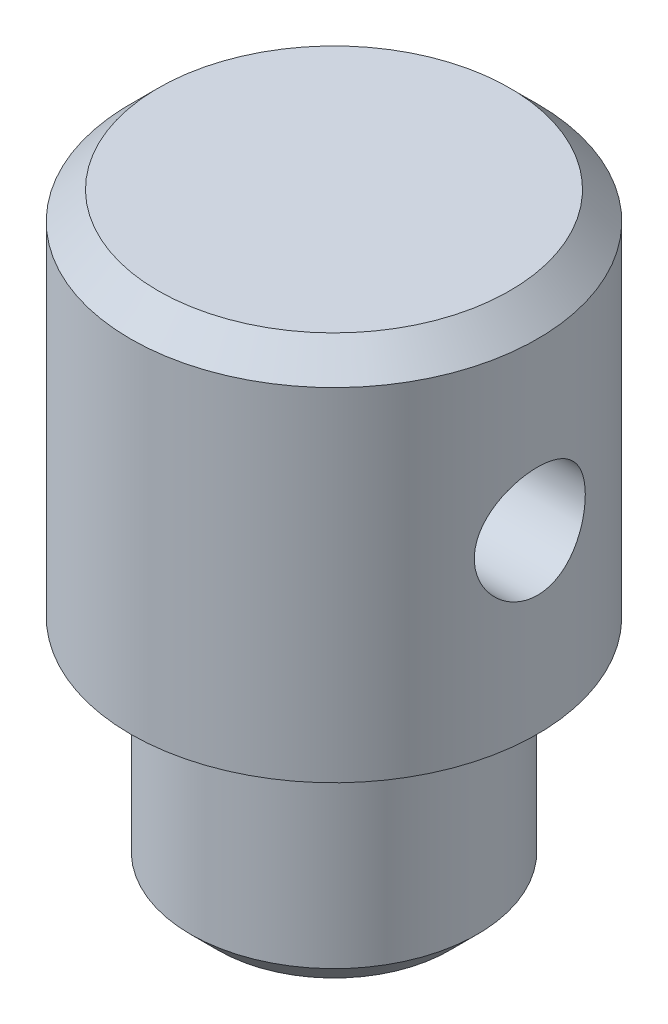
ISO-10303-21;
HEADER;
FILE_DESCRIPTION(('STEP AP214'),'2;1');
FILE_NAME('part.step','',(''),(''),'','','');
FILE_SCHEMA(('AUTOMOTIVE_DESIGN { 1 0 10303 214 1 1 1 1 }'));
ENDSEC;
DATA;
#1=APPLICATION_CONTEXT('core data for automotive mechanical design processes');
#2=APPLICATION_PROTOCOL_DEFINITION('international standard','automotive_design',2000,#1);
#3=PRODUCT_CONTEXT('',#1,'mechanical');
#4=PRODUCT('Part','Part','',(#3));
#5=PRODUCT_RELATED_PRODUCT_CATEGORY('part','',(#4));
#6=PRODUCT_DEFINITION_FORMATION('','',#4);
#7=PRODUCT_DEFINITION_CONTEXT('part definition',#1,'design');
#8=PRODUCT_DEFINITION('design','',#6,#7);
#9=PRODUCT_DEFINITION_SHAPE('','',#8);
#10=(LENGTH_UNIT() NAMED_UNIT(*) SI_UNIT(.MILLI.,.METRE.));
#11=(NAMED_UNIT(*) PLANE_ANGLE_UNIT() SI_UNIT($,.RADIAN.));
#12=(NAMED_UNIT(*) SI_UNIT($,.STERADIAN.) SOLID_ANGLE_UNIT());
#13=UNCERTAINTY_MEASURE_WITH_UNIT(LENGTH_MEASURE(1.E-05),#10,'distance_accuracy_value','');
#14=(GEOMETRIC_REPRESENTATION_CONTEXT(3) GLOBAL_UNCERTAINTY_ASSIGNED_CONTEXT((#13)) GLOBAL_UNIT_ASSIGNED_CONTEXT((#10,
#11,#12)) REPRESENTATION_CONTEXT('',''));
#15=CARTESIAN_POINT('',(0.,0.,0.));
#16=DIRECTION('',(0.,0.,1.));
#17=DIRECTION('',(1.,0.,0.));
#18=AXIS2_PLACEMENT_3D('',#15,#16,#17);
#19=CARTESIAN_POINT('',(0.,11.176,0.));
#20=DIRECTION('',(0.,-1.,0.));
#21=DIRECTION('',(0.,0.,-1.));
#22=AXIS2_PLACEMENT_3D('',#19,#20,#21);
#23=CONICAL_SURFACE('',#22,2.15265,1.02974425867665);
#24=CARTESIAN_POINT('',(0.,11.176,0.));
#25=DIRECTION('',(0.,-1.,0.));
#26=DIRECTION('',(0.,0.,-1.));
#27=AXIS2_PLACEMENT_3D('',#24,#25,#26);
#28=CIRCLE('',#27,2.15265);
#29=CARTESIAN_POINT('',(-1.52030458214746,11.176,-1.52400000000064));
#30=VERTEX_POINT('',#29);
#31=CARTESIAN_POINT('',(1.52030458214793,11.176,-1.524));
#32=VERTEX_POINT('',#31);
#33=EDGE_CURVE('E77',#30,#32,#28,.T.);
#34=ORIENTED_EDGE('',*,*,#33,.T.);
#35=CARTESIAN_POINT('',(3.29787976624261,10.3444721730035,-1.27715992457108));
#36=CARTESIAN_POINT('',(3.23806022010149,10.3738400518025,-1.29627241363358));
#37=CARTESIAN_POINT('',(3.17787610195081,10.4033152891528,-1.31402987169754));
#38=CARTESIAN_POINT('',(3.05689836514172,10.4623889537361,-1.34702798612494));
#39=CARTESIAN_POINT('',(2.99610489098697,10.4919873508327,-1.36226922488032));
#40=CARTESIAN_POINT('',(2.81306640232769,10.5807931001191,-1.404493317376));
#41=CARTESIAN_POINT('',(2.69004686835606,10.6400683088541,-1.42801285330245));
#42=CARTESIAN_POINT('',(2.44281623381528,10.7579894929945,-1.46686163914622));
#43=CARTESIAN_POINT('',(2.31860854064859,10.8166366053152,-1.48220967595342));
#44=CARTESIAN_POINT('',(2.06893056668057,10.9327239517723,-1.50562059032252));
#45=CARTESIAN_POINT('',(1.94346009456202,10.9901639988341,-1.51368234665116));
#46=CARTESIAN_POINT('',(1.71939428513136,11.0901895096117,-1.52221483208197));
#47=CARTESIAN_POINT('',(1.62104785234002,11.1332301697897,-1.52397780570327));
#48=CARTESIAN_POINT('',(1.42341870626431,11.2171325865091,-1.52402175473708));
#49=CARTESIAN_POINT('',(1.32413591557693,11.2579941610276,-1.52230243973389));
#50=CARTESIAN_POINT('',(1.12429075086631,11.3362712864495,-1.51605426325165));
#51=CARTESIAN_POINT('',(1.02372844285154,11.3736870143053,-1.51152554613465));
#52=CARTESIAN_POINT('',(0.871504848960846,11.4255342637082,-1.50353555310034));
#53=CARTESIAN_POINT('',(0.82054133815007,11.4421018027012,-1.50067325232053));
#54=CARTESIAN_POINT('',(0.718034227929452,11.4733907587156,-1.49478666840354));
#55=CARTESIAN_POINT('',(0.666490410105106,11.4881114534652,-1.49176232254885));
#56=CARTESIAN_POINT('',(0.547751983746071,11.5191009978442,-1.48498363500524));
#57=CARTESIAN_POINT('',(0.480344250293535,11.5345853359279,-1.48127127807787));
#58=CARTESIAN_POINT('',(0.344499620014715,11.5602479704979,-1.47482457306655));
#59=CARTESIAN_POINT('',(0.276063628764845,11.5704306831562,-1.47208941159186));
#60=CARTESIAN_POINT('',(0.138951678639813,11.5841510254726,-1.4683470430887));
#61=CARTESIAN_POINT('',(0.0702811409221827,11.587736739125,-1.46732733721198));
#62=CARTESIAN_POINT('',(-0.0670597458897905,11.5878480319342,-1.46729565815834));
#63=CARTESIAN_POINT('',(-0.135730094756946,11.5843740269779,-1.4682835667132));
#64=CARTESIAN_POINT('',(-0.296933261319599,11.5684723199361,-1.47262693772739));
#65=CARTESIAN_POINT('',(-0.389163153625569,11.5532730989821,-1.47670628079921));
#66=CARTESIAN_POINT('',(-0.571690722393062,11.5140653883206,-1.4861630713923));
#67=CARTESIAN_POINT('',(-0.661984655798466,11.4900412217777,-1.49154282313768));
#68=CARTESIAN_POINT('',(-0.841892514905804,11.4359637634229,-1.50192046523429));
#69=CARTESIAN_POINT('',(-0.931485704615879,11.4058424027192,-1.50691307534256));
#70=CARTESIAN_POINT('',(-1.10931125500022,11.3418724486231,-1.51529038452616));
#71=CARTESIAN_POINT('',(-1.19754457363715,11.3080266299092,-1.51867627073525));
#72=CARTESIAN_POINT('',(-1.37510111751281,11.2370856741603,-1.52320018727081));
#73=CARTESIAN_POINT('',(-1.46440296033261,11.19993383608,-1.52428490846007));
#74=CARTESIAN_POINT('',(-1.64168741788549,11.1241841032528,-1.52358756535989));
#75=CARTESIAN_POINT('',(-1.7296748374867,11.0855972131193,-1.52182414194373));
#76=CARTESIAN_POINT('',(-1.96634742101355,10.9799518356338,-1.51280943870004));
#77=CARTESIAN_POINT('',(-2.11446552577952,10.9118469470723,-1.50258356167067));
#78=CARTESIAN_POINT('',(-2.40893900557949,10.7741696351499,-1.4717684821923));
#79=CARTESIAN_POINT('',(-2.55529468345204,10.7045974697319,-1.45118108695517));
#80=CARTESIAN_POINT('',(-2.77454646484487,10.5992900465986,-1.41117909449147));
#81=CARTESIAN_POINT('',(-2.84830843231859,10.5636737432925,-1.39612996131798));
#82=CARTESIAN_POINT('',(-2.99509148068601,10.4924963125573,-1.36269746308424));
#83=CARTESIAN_POINT('',(-3.06811267795447,10.4569351772288,-1.34431463058863));
#84=CARTESIAN_POINT('',(-3.21337320215492,10.3859512482603,-1.30386969905939));
#85=CARTESIAN_POINT('',(-3.2856109704512,10.3505287972152,-1.28180133379812));
#86=CARTESIAN_POINT('',(-3.42893303521438,10.2800509692922,-1.23355477603399));
#87=CARTESIAN_POINT('',(-3.50001665944071,10.2449958102847,-1.20737427689586));
#88=CARTESIAN_POINT('',(-3.57036039394992,10.2102279610125,-1.17892339391072));
#89=B_SPLINE_CURVE_WITH_KNOTS('',3,(#35,#36,#37,#38,#39,#40,#41,#42,#43,#44,#45,#46,#47,#48,#49,
#50,#51,#52,#53,#54,#55,#56,#57,#58,#59,#60,#61,#62,#63,#64,#65,#66,#67,#68,#69,#70,#71,#72,#73,
#74,#75,#76,#77,#78,#79,#80,#81,#82,#83,#84,#85,#86,#87,#88),.UNSPECIFIED.,.F.,.F.,(4,2,2,2,2,2,
2,2,2,2,2,2,2,2,2,2,2,2,2,2,2,2,2,2,2,2,4),(0.,0.207942685373587,0.415837173656637,
0.831222767642638,1.24564918934191,1.66013937328716,1.98216208365632,2.30421165116206,
2.62624467141603,2.78721314026912,2.94824436641919,3.15587005210624,3.36332251098796,
3.56925681384104,3.77517898549164,4.05518268782131,4.33568621974539,4.61951357933277,
4.90313090426998,5.19324986953534,5.48147771234101,5.97119550954031,6.46082792183253,
6.71061514842876,6.96036250614824,7.21053889564728,7.46085612205296),.UNSPECIFIED.);
#90=EDGE_CURVE('E49',#32,#30,#89,.T.);
#91=ORIENTED_EDGE('',*,*,#90,.T.);
#92=EDGE_LOOP('',(#34,#91));
#93=FACE_BOUND('',#92,.T.);
#94=ADVANCED_FACE('F34',(#93),#23,.F.);
#95=CARTESIAN_POINT('',(3.937,0.,0.));
#96=DIRECTION('',(0.,1.,0.));
#97=DIRECTION('',(0.,0.,1.));
#98=AXIS2_PLACEMENT_3D('',#95,#96,#97);
#99=PLANE('',#98);
#100=CARTESIAN_POINT('',(0.,0.,0.));
#101=DIRECTION('',(0.,1.,0.));
#102=DIRECTION('',(0.,0.,1.));
#103=AXIS2_PLACEMENT_3D('',#100,#101,#102);
#104=CIRCLE('',#103,3.175);
#105=CARTESIAN_POINT('',(0.,0.,3.175));
#106=VERTEX_POINT('',#105);
#107=EDGE_CURVE('E11',#106,#106,#104,.F.);
#108=ORIENTED_EDGE('',*,*,#107,.T.);
#109=EDGE_LOOP('',(#108));
#110=FACE_BOUND('',#109,.T.);
#111=CARTESIAN_POINT('',(0.,0.,0.));
#112=DIRECTION('',(0.,-1.,0.));
#113=DIRECTION('',(0.,0.,-1.));
#114=AXIS2_PLACEMENT_3D('',#111,#112,#113);
#115=CIRCLE('',#114,2.15265);
#116=CARTESIAN_POINT('',(0.,0.,-2.15265));
#117=VERTEX_POINT('',#116);
#118=EDGE_CURVE('E82',#117,#117,#115,.T.);
#119=ORIENTED_EDGE('',*,*,#118,.F.);
#120=EDGE_LOOP('',(#119));
#121=FACE_BOUND('',#120,.T.);
#122=ADVANCED_FACE('F142',(#110,#121),#99,.F.);
#123=CARTESIAN_POINT('',(0.,16.51,0.));
#124=DIRECTION('',(0.,-1.,0.));
#125=DIRECTION('',(0.,0.,-1.));
#126=AXIS2_PLACEMENT_3D('',#123,#124,#125);
#127=PLANE('',#126);
#128=CARTESIAN_POINT('',(0.,16.51,0.));
#129=DIRECTION('',(0.,1.,0.));
#130=DIRECTION('',(0.,0.,1.));
#131=AXIS2_PLACEMENT_3D('',#128,#129,#130);
#132=CIRCLE('',#131,4.826);
#133=CARTESIAN_POINT('',(0.,16.51,4.826));
#134=VERTEX_POINT('',#133);
#135=EDGE_CURVE('E67',#134,#134,#132,.T.);
#136=ORIENTED_EDGE('',*,*,#135,.T.);
#137=EDGE_LOOP('',(#136));
#138=FACE_BOUND('',#137,.T.);
#139=ADVANCED_FACE('F139',(#138),#127,.F.);
#140=CARTESIAN_POINT('',(0.,15.748,0.));
#141=DIRECTION('',(0.,-1.,0.));
#142=DIRECTION('',(0.,0.,-1.));
#143=AXIS2_PLACEMENT_3D('',#140,#141,#142);
#144=CONICAL_SURFACE('',#143,5.588,0.78539816339745);
#145=ORIENTED_EDGE('',*,*,#135,.F.);
#146=EDGE_LOOP('',(#145));
#147=FACE_BOUND('',#146,.T.);
#148=CARTESIAN_POINT('',(0.,15.748,0.));
#149=DIRECTION('',(0.,1.,0.));
#150=DIRECTION('',(0.,0.,1.));
#151=AXIS2_PLACEMENT_3D('',#148,#149,#150);
#152=CIRCLE('',#151,5.588);
#153=CARTESIAN_POINT('',(0.,15.748,5.588));
#154=VERTEX_POINT('',#153);
#155=EDGE_CURVE('E88',#154,#154,#152,.T.);
#156=ORIENTED_EDGE('',*,*,#155,.T.);
#157=EDGE_LOOP('',(#156));
#158=FACE_BOUND('',#157,.T.);
#159=ADVANCED_FACE('F133',(#147,#158),#144,.T.);
#160=CARTESIAN_POINT('',(0.,0.,0.));
#161=DIRECTION('',(0.,1.,0.));
#162=DIRECTION('',(0.,0.,1.));
#163=AXIS2_PLACEMENT_3D('',#160,#161,#162);
#164=CYLINDRICAL_SURFACE('',#163,5.588);
#165=CARTESIAN_POINT('',(-5.37616666408325,11.176,-1.524));
#166=CARTESIAN_POINT('',(-5.37616804300174,11.2598773542442,-1.52399812748182));
#167=CARTESIAN_POINT('',(-5.37815107297096,11.3437742237148,-1.51705179532106));
#168=CARTESIAN_POINT('',(-5.38584385776009,11.5091398217048,-1.48950589161902));
#169=CARTESIAN_POINT('',(-5.39155537083186,11.5906073856665,-1.46889987847042));
#170=CARTESIAN_POINT('',(-5.40601120873454,11.7486980549692,-1.41476653416715));
#171=CARTESIAN_POINT('',(-5.41475113378016,11.8253279986787,-1.38125794052848));
#172=CARTESIAN_POINT('',(-5.43427335932362,11.9718918643845,-1.30232987207622));
#173=CARTESIAN_POINT('',(-5.44505584499428,12.0418251784171,-1.25690931721396));
#174=CARTESIAN_POINT('',(-5.46776438926798,12.1748399701,-1.15417585630728));
#175=CARTESIAN_POINT('',(-5.47971145954727,12.2377203336321,-1.0966071460596));
#176=CARTESIAN_POINT('',(-5.50322201657108,12.3530641002491,-0.971761355639928));
#177=CARTESIAN_POINT('',(-5.51478546187961,12.4055263810907,-0.904483230909276));
#178=CARTESIAN_POINT('',(-5.53646108440237,12.4993894048394,-0.760727553893654));
#179=CARTESIAN_POINT('',(-5.5465455894474,12.5405893173757,-0.68411433724799));
#180=CARTESIAN_POINT('',(-5.56388546919599,12.6094468340738,-0.524727131449397));
#181=CARTESIAN_POINT('',(-5.57114134372015,12.6371068309674,-0.441954233796653));
#182=CARTESIAN_POINT('',(-5.58185783372693,12.677445915853,-0.274697395077595));
#183=CARTESIAN_POINT('',(-5.58540503031416,12.6904673233222,-0.190301659954003));
#184=CARTESIAN_POINT('',(-5.58860759100706,12.7022375391347,-0.0204539814183477));
#185=CARTESIAN_POINT('',(-5.58826363527664,12.7009888418572,0.0649977747953786));
#186=CARTESIAN_POINT('',(-5.58378569705786,12.6844934029732,0.232145901673825));
#187=CARTESIAN_POINT('',(-5.57975189420777,12.6696166487076,0.313881881180458));
#188=CARTESIAN_POINT('',(-5.56846632402499,12.6268862703369,0.473650060975058));
#189=CARTESIAN_POINT('',(-5.56121436908868,12.5990318896904,0.551682045043329));
#190=CARTESIAN_POINT('',(-5.54416050301587,12.5308592299835,0.702760328685212));
#191=CARTESIAN_POINT('',(-5.53433319527761,12.4904160161333,0.775747267899446));
#192=CARTESIAN_POINT('',(-5.51318468463169,12.3983100834243,0.914023336959573));
#193=CARTESIAN_POINT('',(-5.50186317923083,12.3466450913987,0.979310903022773));
#194=CARTESIAN_POINT('',(-5.47852214729657,12.2316057169572,1.10254364073896));
#195=CARTESIAN_POINT('',(-5.46649187925547,12.1679089413082,1.16018618114064));
#196=CARTESIAN_POINT('',(-5.4434150595319,12.0316292614448,1.26404701502684));
#197=CARTESIAN_POINT('',(-5.43236857370046,11.9590457631546,1.31026454412704));
#198=CARTESIAN_POINT('',(-5.41246539163475,11.8063727356956,1.39020808985143));
#199=CARTESIAN_POINT('',(-5.40362387870643,11.7262361301334,1.42384824981065));
#200=CARTESIAN_POINT('',(-5.38931851221236,11.5611426361352,1.4770775620601));
#201=CARTESIAN_POINT('',(-5.38385377653585,11.4761870129011,1.4966703841311));
#202=CARTESIAN_POINT('',(-5.3771096438631,11.3067061835859,1.52071960483487));
#203=CARTESIAN_POINT('',(-5.37570505135209,11.2222501622477,1.52562894328488));
#204=CARTESIAN_POINT('',(-5.37689705621479,11.0537232381613,1.52142273932798));
#205=CARTESIAN_POINT('',(-5.37949320537176,10.9696522933299,1.51230876800049));
#206=CARTESIAN_POINT('',(-5.38827289403757,10.8060516036917,1.48071472169164));
#207=CARTESIAN_POINT('',(-5.39438240612689,10.7264642766401,1.45851023115131));
#208=CARTESIAN_POINT('',(-5.40942734659486,10.5721444539105,1.40167697147948));
#209=CARTESIAN_POINT('',(-5.4183631563766,10.4974126151123,1.36704652540581));
#210=CARTESIAN_POINT('',(-5.43830833062875,10.3530392805023,1.28543548631498));
#211=CARTESIAN_POINT('',(-5.44936041534607,10.2835531443029,1.2381907407348));
#212=CARTESIAN_POINT('',(-5.47219390937907,10.1533288775687,1.13301720688669));
#213=CARTESIAN_POINT('',(-5.48397546202295,10.0925924740583,1.07508631451621));
#214=CARTESIAN_POINT('',(-5.5073739486149,9.97969417422619,0.948083816809208));
#215=CARTESIAN_POINT('',(-5.5189749898684,9.92784907651086,0.878727069079916));
#216=CARTESIAN_POINT('',(-5.54033899968769,9.83653543474756,0.732033646426998));
#217=CARTESIAN_POINT('',(-5.55010206602792,9.79706623226694,0.654697396326539));
#218=CARTESIAN_POINT('',(-5.56662715196827,9.73199266068196,0.494784215562342));
#219=CARTESIAN_POINT('',(-5.57341167863512,9.7062839754547,0.412252173457353));
#220=CARTESIAN_POINT('',(-5.58331445001243,9.6691633362142,0.243825638558386));
#221=CARTESIAN_POINT('',(-5.58643354749725,9.65774805675184,0.1579319326738));
#222=CARTESIAN_POINT('',(-5.58861170674628,9.64975451798798,-0.0118259551969336));
#223=CARTESIAN_POINT('',(-5.58779766354495,9.65271254995239,-0.095666975854073));
#224=CARTESIAN_POINT('',(-5.58249008252059,9.67229945374695,-0.261611165511358));
#225=CARTESIAN_POINT('',(-5.57799669433588,9.68892776960916,-0.343714405047454));
#226=CARTESIAN_POINT('',(-5.5658625072452,9.7351162882649,-0.503267506235996));
#227=CARTESIAN_POINT('',(-5.5582455611002,9.76457858941208,-0.580747643983709));
#228=CARTESIAN_POINT('',(-5.54065887974846,9.83551156747967,-0.729708847536494));
#229=CARTESIAN_POINT('',(-5.53068880321045,9.87698398671552,-0.801189040983807));
#230=CARTESIAN_POINT('',(-5.50911559945224,9.97209560393421,-0.938264493998557));
#231=CARTESIAN_POINT('',(-5.4974749461141,10.0260394575956,-1.00364243590428));
#232=CARTESIAN_POINT('',(-5.47401845248945,10.143990012767,-1.12457480132179));
#233=CARTESIAN_POINT('',(-5.46220256622777,10.2079993989985,-1.18012659553798));
#234=CARTESIAN_POINT('',(-5.43941515917497,10.3460575672602,-1.2811146951888));
#235=CARTESIAN_POINT('',(-5.42846972381451,10.4203055019237,-1.32628517864541));
#236=CARTESIAN_POINT('',(-5.40903826233291,10.575631320272,-1.40343947203878));
#237=CARTESIAN_POINT('',(-5.40055069933018,10.6567048948385,-1.43543152761789));
#238=CARTESIAN_POINT('',(-5.38811705277488,10.8105123075606,-1.48135452930553));
#239=CARTESIAN_POINT('',(-5.38367291879896,10.8826081242516,-1.49730796522498));
#240=CARTESIAN_POINT('',(-5.37769730231429,11.0284644026692,-1.5186308544203));
#241=CARTESIAN_POINT('',(-5.37616545123871,11.1022246525561,-1.52400164699614));
#242=CARTESIAN_POINT('',(-5.37616666408325,11.176,-1.524));
#243=B_SPLINE_CURVE_WITH_KNOTS('',3,(#165,#166,#167,#168,#169,#170,#171,#172,#173,#174,#175,
#176,#177,#178,#179,#180,#181,#182,#183,#184,#185,#186,#187,#188,#189,#190,#191,#192,#193,#194,
#195,#196,#197,#198,#199,#200,#201,#202,#203,#204,#205,#206,#207,#208,#209,#210,#211,#212,#213,
#214,#215,#216,#217,#218,#219,#220,#221,#222,#223,#224,#225,#226,#227,#228,#229,#230,#231,#232,
#233,#234,#235,#236,#237,#238,#239,#240,#241,#242),.UNSPECIFIED.,.T.,.F.,(4,2,2,2,2,2,2,2,2,2,2,
2,2,2,2,2,2,2,2,2,2,2,2,2,2,2,2,2,2,2,2,2,2,2,2,2,2,2,4),(0.,0.251360636614238,0.50283989382213,
0.753955314328074,1.00509351115907,1.26216996232839,1.51927409095353,1.78070136944699,
2.04208243263313,2.29721504509398,2.55230306168678,2.80066457783834,3.04904057423919,
3.29996464428527,3.55093959085982,3.80996359536082,4.0690049250377,4.32978358659915,
4.59049409648812,4.84307501325495,5.09562763457735,5.34304430446494,5.59049437698226,
5.84359944297056,6.09675439865193,6.35760533583373,6.61844239265153,6.87727302996514,
7.13604343753665,7.38652194057101,7.63699025719444,7.88558049560441,8.13420681523925,
8.38970641481071,8.64527427827086,8.90679632125801,9.16815448242474,9.38926977393829,
9.61035708012516),.UNSPECIFIED.);
#244=CARTESIAN_POINT('',(-5.37616666408325,11.176,-1.524));
#245=VERTEX_POINT('',#244);
#246=EDGE_CURVE('E124',#245,#245,#243,.T.);
#247=ORIENTED_EDGE('',*,*,#246,.T.);
#248=EDGE_LOOP('',(#247));
#249=FACE_BOUND('',#248,.T.);
#250=CARTESIAN_POINT('',(5.37616666408325,11.176,-1.524));
#251=CARTESIAN_POINT('',(5.37616804300174,11.0921226457558,-1.52399812748182));
#252=CARTESIAN_POINT('',(5.37815107297096,11.0082257762852,-1.51705179532106));
#253=CARTESIAN_POINT('',(5.38584385776009,10.8428601782952,-1.48950589161902));
#254=CARTESIAN_POINT('',(5.39155537083186,10.7613926143335,-1.46889987847042));
#255=CARTESIAN_POINT('',(5.40601120873454,10.6033019450308,-1.41476653416715));
#256=CARTESIAN_POINT('',(5.41475113378016,10.5266720013213,-1.38125794052848));
#257=CARTESIAN_POINT('',(5.43427335932362,10.3801081356155,-1.30232987207622));
#258=CARTESIAN_POINT('',(5.44505584499428,10.3101748215829,-1.25690931721396));
#259=CARTESIAN_POINT('',(5.46776438926798,10.1771600299,-1.15417585630728));
#260=CARTESIAN_POINT('',(5.47971145954727,10.1142796663679,-1.0966071460596));
#261=CARTESIAN_POINT('',(5.50322201657108,9.9989358997509,-0.971761355639928));
#262=CARTESIAN_POINT('',(5.51478546187961,9.94647361890933,-0.904483230909276));
#263=CARTESIAN_POINT('',(5.53646108440237,9.85261059516055,-0.760727553893654));
#264=CARTESIAN_POINT('',(5.5465455894474,9.81141068262433,-0.68411433724799));
#265=CARTESIAN_POINT('',(5.56388546919599,9.74255316592621,-0.524727131449397));
#266=CARTESIAN_POINT('',(5.57114134372015,9.71489316903259,-0.441954233796653));
#267=CARTESIAN_POINT('',(5.58185783372693,9.67455408414697,-0.274697395077595));
#268=CARTESIAN_POINT('',(5.58540503031416,9.66153267667783,-0.190301659954003));
#269=CARTESIAN_POINT('',(5.58860759100706,9.64976246086528,-0.0204539814183477));
#270=CARTESIAN_POINT('',(5.58826363527664,9.65101115814281,0.0649977747953786));
#271=CARTESIAN_POINT('',(5.58378569705786,9.66750659702677,0.232145901673825));
#272=CARTESIAN_POINT('',(5.57975189420777,9.68238335129237,0.313881881180458));
#273=CARTESIAN_POINT('',(5.56846632402499,9.72511372966311,0.473650060975058));
#274=CARTESIAN_POINT('',(5.56121436908868,9.75296811030959,0.551682045043329));
#275=CARTESIAN_POINT('',(5.54416050301587,9.82114077001651,0.702760328685212));
#276=CARTESIAN_POINT('',(5.53433319527761,9.8615839838667,0.775747267899446));
#277=CARTESIAN_POINT('',(5.51318468463169,9.95368991657568,0.914023336959573));
#278=CARTESIAN_POINT('',(5.50186317923083,10.0053549086013,0.979310903022773));
#279=CARTESIAN_POINT('',(5.47852214729657,10.1203942830428,1.10254364073896));
#280=CARTESIAN_POINT('',(5.46649187925547,10.1840910586918,1.16018618114064));
#281=CARTESIAN_POINT('',(5.4434150595319,10.3203707385552,1.26404701502684));
#282=CARTESIAN_POINT('',(5.43236857370046,10.3929542368454,1.31026454412704));
#283=CARTESIAN_POINT('',(5.41246539163475,10.5456272643044,1.39020808985143));
#284=CARTESIAN_POINT('',(5.40362387870643,10.6257638698666,1.42384824981065));
#285=CARTESIAN_POINT('',(5.38931851221236,10.7908573638648,1.47707756206009));
#286=CARTESIAN_POINT('',(5.38385377653585,10.8758129870989,1.4966703841311));
#287=CARTESIAN_POINT('',(5.3771096438631,11.0452938164141,1.52071960483487));
#288=CARTESIAN_POINT('',(5.37570505135209,11.1297498377523,1.52562894328488));
#289=CARTESIAN_POINT('',(5.37689705621479,11.2982767618387,1.52142273932798));
#290=CARTESIAN_POINT('',(5.37949320537176,11.3823477066701,1.51230876800049));
#291=CARTESIAN_POINT('',(5.38827289403757,11.5459483963083,1.48071472169164));
#292=CARTESIAN_POINT('',(5.39438240612689,11.6255357233599,1.45851023115131));
#293=CARTESIAN_POINT('',(5.40942734659486,11.7798555460895,1.40167697147948));
#294=CARTESIAN_POINT('',(5.4183631563766,11.8545873848877,1.36704652540581));
#295=CARTESIAN_POINT('',(5.43830833062875,11.9989607194977,1.28543548631498));
#296=CARTESIAN_POINT('',(5.44936041534607,12.0684468556971,1.2381907407348));
#297=CARTESIAN_POINT('',(5.47219390937907,12.1986711224313,1.13301720688669));
#298=CARTESIAN_POINT('',(5.48397546202295,12.2594075259417,1.07508631451621));
#299=CARTESIAN_POINT('',(5.5073739486149,12.3723058257738,0.948083816809208));
#300=CARTESIAN_POINT('',(5.5189749898684,12.4241509234891,0.878727069079915));
#301=CARTESIAN_POINT('',(5.54033899968769,12.5154645652524,0.732033646426997));
#302=CARTESIAN_POINT('',(5.55010206602792,12.5549337677331,0.654697396326539));
#303=CARTESIAN_POINT('',(5.56662715196827,12.620007339318,0.494784215562342));
#304=CARTESIAN_POINT('',(5.57341167863512,12.6457160245453,0.412252173457353));
#305=CARTESIAN_POINT('',(5.58331445001243,12.6828366637858,0.243825638558385));
#306=CARTESIAN_POINT('',(5.58643354749725,12.6942519432482,0.1579319326738));
#307=CARTESIAN_POINT('',(5.58861170674628,12.702245482012,-0.0118259551969336));
#308=CARTESIAN_POINT('',(5.58779766354495,12.6992874500476,-0.0956669758540732));
#309=CARTESIAN_POINT('',(5.58249008252059,12.6797005462531,-0.261611165511358));
#310=CARTESIAN_POINT('',(5.57799669433588,12.6630722303908,-0.343714405047454));
#311=CARTESIAN_POINT('',(5.5658625072452,12.6168837117351,-0.503267506235996));
#312=CARTESIAN_POINT('',(5.5582455611002,12.5874214105879,-0.580747643983709));
#313=CARTESIAN_POINT('',(5.54065887974846,12.5164884325203,-0.729708847536494));
#314=CARTESIAN_POINT('',(5.53068880321045,12.4750160132845,-0.801189040983807));
#315=CARTESIAN_POINT('',(5.50911559945224,12.3799043960658,-0.938264493998558));
#316=CARTESIAN_POINT('',(5.4974749461141,12.3259605424044,-1.00364243590428));
#317=CARTESIAN_POINT('',(5.47401845248945,12.208009987233,-1.12457480132179));
#318=CARTESIAN_POINT('',(5.46220256622777,12.1440006010015,-1.18012659553798));
#319=CARTESIAN_POINT('',(5.43941515917497,12.0059424327398,-1.2811146951888));
#320=CARTESIAN_POINT('',(5.42846972381451,11.9316944980763,-1.32628517864541));
#321=CARTESIAN_POINT('',(5.40903826233291,11.776368679728,-1.40343947203878));
#322=CARTESIAN_POINT('',(5.40055069933018,11.6952951051615,-1.43543152761789));
#323=CARTESIAN_POINT('',(5.38811705277488,11.5414876924394,-1.48135452930553));
#324=CARTESIAN_POINT('',(5.38367291879896,11.4693918757484,-1.49730796522498));
#325=CARTESIAN_POINT('',(5.37769730231429,11.3235355973308,-1.5186308544203));
#326=CARTESIAN_POINT('',(5.37616545123871,11.2497753474439,-1.52400164699614));
#327=CARTESIAN_POINT('',(5.37616666408325,11.176,-1.524));
#328=B_SPLINE_CURVE_WITH_KNOTS('',3,(#250,#251,#252,#253,#254,#255,#256,#257,#258,#259,#260,
#261,#262,#263,#264,#265,#266,#267,#268,#269,#270,#271,#272,#273,#274,#275,#276,#277,#278,#279,
#280,#281,#282,#283,#284,#285,#286,#287,#288,#289,#290,#291,#292,#293,#294,#295,#296,#297,#298,
#299,#300,#301,#302,#303,#304,#305,#306,#307,#308,#309,#310,#311,#312,#313,#314,#315,#316,#317,
#318,#319,#320,#321,#322,#323,#324,#325,#326,#327),.UNSPECIFIED.,.T.,.F.,(4,2,2,2,2,2,2,2,2,2,2,
2,2,2,2,2,2,2,2,2,2,2,2,2,2,2,2,2,2,2,2,2,2,2,2,2,2,2,4),(0.,0.251360636614238,0.50283989382213,
0.753955314328074,1.00509351115907,1.26216996232839,1.51927409095353,1.78070136944699,
2.04208243263313,2.29721504509398,2.55230306168678,2.80066457783834,3.04904057423919,
3.29996464428527,3.55093959085982,3.80996359536082,4.0690049250377,4.32978358659915,
4.59049409648812,4.84307501325495,5.09562763457735,5.34304430446494,5.59049437698226,
5.84359944297056,6.09675439865193,6.35760533583373,6.61844239265153,6.87727302996514,
7.13604343753665,7.38652194057101,7.63699025719444,7.88558049560441,8.13420681523925,
8.38970641481071,8.64527427827086,8.90679632125801,9.16815448242474,9.38926977393829,
9.61035708012516),.UNSPECIFIED.);
#329=CARTESIAN_POINT('',(5.37616666408325,11.176,-1.524));
#330=VERTEX_POINT('',#329);
#331=EDGE_CURVE('E119',#330,#330,#328,.T.);
#332=ORIENTED_EDGE('',*,*,#331,.T.);
#333=EDGE_LOOP('',(#332));
#334=FACE_BOUND('',#333,.T.);
#335=ORIENTED_EDGE('',*,*,#155,.F.);
#336=EDGE_LOOP('',(#335));
#337=FACE_BOUND('',#336,.T.);
#338=CARTESIAN_POINT('',(0.,6.35,0.));
#339=DIRECTION('',(0.,1.,0.));
#340=DIRECTION('',(0.,0.,1.));
#341=AXIS2_PLACEMENT_3D('',#338,#339,#340);
#342=CIRCLE('',#341,5.588);
#343=CARTESIAN_POINT('',(0.,6.35,5.588));
#344=VERTEX_POINT('',#343);
#345=EDGE_CURVE('E80',#344,#344,#342,.T.);
#346=ORIENTED_EDGE('',*,*,#345,.T.);
#347=EDGE_LOOP('',(#346));
#348=FACE_BOUND('',#347,.T.);
#349=ADVANCED_FACE('F127',(#249,#334,#337,#348),#164,.T.);
#350=CARTESIAN_POINT('',(5.588,6.35,0.));
#351=DIRECTION('',(0.,1.,0.));
#352=DIRECTION('',(0.,0.,1.));
#353=AXIS2_PLACEMENT_3D('',#350,#351,#352);
#354=PLANE('',#353);
#355=ORIENTED_EDGE('',*,*,#345,.F.);
#356=EDGE_LOOP('',(#355));
#357=FACE_BOUND('',#356,.T.);
#358=CARTESIAN_POINT('',(0.,6.35,0.));
#359=DIRECTION('',(0.,1.,0.));
#360=DIRECTION('',(0.,0.,1.));
#361=AXIS2_PLACEMENT_3D('',#358,#359,#360);
#362=CIRCLE('',#361,3.937);
#363=CARTESIAN_POINT('',(0.,6.35,3.937));
#364=VERTEX_POINT('',#363);
#365=EDGE_CURVE('E76',#364,#364,#362,.T.);
#366=ORIENTED_EDGE('',*,*,#365,.T.);
#367=EDGE_LOOP('',(#366));
#368=FACE_BOUND('',#367,.T.);
#369=ADVANCED_FACE('F132',(#357,#368),#354,.F.);
#370=CARTESIAN_POINT('',(0.,0.,0.));
#371=DIRECTION('',(0.,1.,0.));
#372=DIRECTION('',(0.,0.,1.));
#373=AXIS2_PLACEMENT_3D('',#370,#371,#372);
#374=CYLINDRICAL_SURFACE('',#373,3.937);
#375=CARTESIAN_POINT('',(0.,0.762,0.));
#376=DIRECTION('',(0.,1.,0.));
#377=DIRECTION('',(0.,0.,1.));
#378=AXIS2_PLACEMENT_3D('',#375,#376,#377);
#379=CIRCLE('',#378,3.937);
#380=CARTESIAN_POINT('',(0.,0.762,3.937));
#381=VERTEX_POINT('',#380);
#382=EDGE_CURVE('E42',#381,#381,#379,.T.);
#383=ORIENTED_EDGE('',*,*,#382,.T.);
#384=EDGE_LOOP('',(#383));
#385=FACE_BOUND('',#384,.T.);
#386=ORIENTED_EDGE('',*,*,#365,.F.);
#387=EDGE_LOOP('',(#386));
#388=FACE_BOUND('',#387,.T.);
#389=ADVANCED_FACE('F165',(#385,#388),#374,.T.);
#390=CARTESIAN_POINT('',(1.52030458214793,11.176,1.524));
#391=VERTEX_POINT('',#390);
#392=CARTESIAN_POINT('',(-1.52030458214883,11.1759999999997,1.52400000000048));
#393=VERTEX_POINT('',#392);
#394=EDGE_CURVE('E72',#391,#393,#28,.T.);
#395=ORIENTED_EDGE('',*,*,#394,.T.);
#396=CARTESIAN_POINT('',(-3.29787976624261,10.3444721730035,1.27715992457108));
#397=CARTESIAN_POINT('',(-3.23806022010149,10.3738400518025,1.29627241363358));
#398=CARTESIAN_POINT('',(-3.17787610195081,10.4033152891528,1.31402987169754));
#399=CARTESIAN_POINT('',(-3.05689836514172,10.4623889537361,1.34702798612494));
#400=CARTESIAN_POINT('',(-2.99610489098697,10.4919873508327,1.36226922488032));
#401=CARTESIAN_POINT('',(-2.81306640232769,10.5807931001191,1.404493317376));
#402=CARTESIAN_POINT('',(-2.69004686835606,10.6400683088541,1.42801285330245));
#403=CARTESIAN_POINT('',(-2.44281623381528,10.7579894929945,1.46686163914622));
#404=CARTESIAN_POINT('',(-2.31860854064859,10.8166366053152,1.48220967595342));
#405=CARTESIAN_POINT('',(-2.06893056668057,10.9327239517723,1.50562059032252));
#406=CARTESIAN_POINT('',(-1.94346009456202,10.9901639988341,1.51368234665116));
#407=CARTESIAN_POINT('',(-1.71939428513136,11.0901895096117,1.52221483208197));
#408=CARTESIAN_POINT('',(-1.62104785234002,11.1332301697897,1.52397780570327));
#409=CARTESIAN_POINT('',(-1.42341870626431,11.2171325865091,1.52402175473708));
#410=CARTESIAN_POINT('',(-1.32413591557693,11.2579941610276,1.52230243973389));
#411=CARTESIAN_POINT('',(-1.12429075086631,11.3362712864495,1.51605426325165));
#412=CARTESIAN_POINT('',(-1.02372844285154,11.3736870143053,1.51152554613465));
#413=CARTESIAN_POINT('',(-0.871504848960847,11.4255342637082,1.50353555310034));
#414=CARTESIAN_POINT('',(-0.820541338150071,11.4421018027012,1.50067325232053));
#415=CARTESIAN_POINT('',(-0.718034227929453,11.4733907587156,1.49478666840354));
#416=CARTESIAN_POINT('',(-0.666490410105107,11.4881114534652,1.49176232254885));
#417=CARTESIAN_POINT('',(-0.547751983746072,11.5191009978442,1.48498363500524));
#418=CARTESIAN_POINT('',(-0.480344250293535,11.5345853359279,1.48127127807787));
#419=CARTESIAN_POINT('',(-0.344499620014716,11.5602479704979,1.47482457306655));
#420=CARTESIAN_POINT('',(-0.276063628764846,11.5704306831562,1.47208941159186));
#421=CARTESIAN_POINT('',(-0.138951678639814,11.5841510254726,1.4683470430887));
#422=CARTESIAN_POINT('',(-0.0702811409221833,11.587736739125,1.46732733721198));
#423=CARTESIAN_POINT('',(0.0670597458897898,11.5878480319342,1.46729565815834));
#424=CARTESIAN_POINT('',(0.135730094756946,11.5843740269779,1.4682835667132));
#425=CARTESIAN_POINT('',(0.296933261319599,11.5684723199361,1.47262693772739));
#426=CARTESIAN_POINT('',(0.389163153625569,11.5532730989821,1.47670628079921));
#427=CARTESIAN_POINT('',(0.571690722393062,11.5140653883206,1.4861630713923));
#428=CARTESIAN_POINT('',(0.661984655798466,11.4900412217777,1.49154282313768));
#429=CARTESIAN_POINT('',(0.841892514905803,11.4359637634229,1.50192046523429));
#430=CARTESIAN_POINT('',(0.931485704615878,11.4058424027192,1.50691307534256));
#431=CARTESIAN_POINT('',(1.10931125500022,11.3418724486231,1.51529038452616));
#432=CARTESIAN_POINT('',(1.19754457363715,11.3080266299092,1.51867627073525));
#433=CARTESIAN_POINT('',(1.3751011175128,11.2370856741603,1.52320018727081));
#434=CARTESIAN_POINT('',(1.46440296033261,11.19993383608,1.52428490846007));
#435=CARTESIAN_POINT('',(1.64168741788549,11.1241841032528,1.52358756535989));
#436=CARTESIAN_POINT('',(1.7296748374867,11.0855972131193,1.52182414194373));
#437=CARTESIAN_POINT('',(1.96634742101355,10.9799518356338,1.51280943870004));
#438=CARTESIAN_POINT('',(2.11446552577952,10.9118469470723,1.50258356167067));
#439=CARTESIAN_POINT('',(2.40893900557949,10.7741696351499,1.4717684821923));
#440=CARTESIAN_POINT('',(2.55529468345204,10.7045974697319,1.45118108695517));
#441=CARTESIAN_POINT('',(2.77454646484486,10.5992900465986,1.41117909449147));
#442=CARTESIAN_POINT('',(2.84830843231859,10.5636737432925,1.39612996131798));
#443=CARTESIAN_POINT('',(2.99509148068601,10.4924963125573,1.36269746308424));
#444=CARTESIAN_POINT('',(3.06811267795447,10.4569351772288,1.34431463058863));
#445=CARTESIAN_POINT('',(3.21337320215492,10.3859512482603,1.30386969905939));
#446=CARTESIAN_POINT('',(3.2856109704512,10.3505287972152,1.28180133379812));
#447=CARTESIAN_POINT('',(3.42893303521438,10.2800509692922,1.23355477603399));
#448=CARTESIAN_POINT('',(3.50001665944071,10.2449958102847,1.20737427689586));
#449=CARTESIAN_POINT('',(3.57036039394992,10.2102279610125,1.17892339391073));
#450=B_SPLINE_CURVE_WITH_KNOTS('',3,(#396,#397,#398,#399,#400,#401,#402,#403,#404,#405,#406,
#407,#408,#409,#410,#411,#412,#413,#414,#415,#416,#417,#418,#419,#420,#421,#422,#423,#424,#425,
#426,#427,#428,#429,#430,#431,#432,#433,#434,#435,#436,#437,#438,#439,#440,#441,#442,#443,#444,
#445,#446,#447,#448,#449),.UNSPECIFIED.,.F.,.F.,(4,2,2,2,2,2,2,2,2,2,2,2,2,2,2,2,2,2,2,2,2,2,2,
2,2,2,4),(0.,0.207942685373588,0.415837173656637,0.831222767642638,1.24564918934191,
1.66013937328716,1.98216208365632,2.30421165116206,2.62624467141603,2.78721314026912,
2.94824436641919,3.15587005210624,3.36332251098796,3.56925681384104,3.77517898549164,
4.05518268782131,4.33568621974539,4.61951357933277,4.90313090426998,5.19324986953534,
5.48147771234101,5.9711955095403,6.46082792183253,6.71061514842876,6.96036250614824,
7.21053889564728,7.46085612205296),.UNSPECIFIED.);
#451=EDGE_CURVE('E62',#393,#391,#450,.T.);
#452=ORIENTED_EDGE('',*,*,#451,.T.);
#453=EDGE_LOOP('',(#395,#452));
#454=FACE_BOUND('',#453,.T.);
#455=ADVANCED_FACE('F71',(#454),#23,.F.);
#456=CARTESIAN_POINT('',(0.,0.,0.));
#457=DIRECTION('',(0.,-1.,0.));
#458=DIRECTION('',(0.,0.,-1.));
#459=AXIS2_PLACEMENT_3D('',#456,#457,#458);
#460=CYLINDRICAL_SURFACE('',#459,2.15265);
#461=ORIENTED_EDGE('',*,*,#33,.F.);
#462=CARTESIAN_POINT('',(-1.52030458214793,11.176,-1.524));
#463=CARTESIAN_POINT('',(-1.52028041114612,11.1392742218495,-1.52401062911533));
#464=CARTESIAN_POINT('',(-1.521634726969,11.102564178024,-1.52267296224571));
#465=CARTESIAN_POINT('',(-1.5269127544076,11.0295774025255,-1.51738728520692));
#466=CARTESIAN_POINT('',(-1.53083221792769,10.9933000552357,-1.51344359072936));
#467=CARTESIAN_POINT('',(-1.54099669745515,10.9218603688979,-1.5030900641034));
#468=CARTESIAN_POINT('',(-1.54721510044196,10.886690083004,-1.49670842696505));
#469=CARTESIAN_POINT('',(-1.56168269459054,10.8172810570871,-1.48160696896368));
#470=CARTESIAN_POINT('',(-1.56993263635501,10.7830426665803,-1.4728862837745));
#471=CARTESIAN_POINT('',(-1.59711395976382,10.6824466947381,-1.44354925196224));
#472=CARTESIAN_POINT('',(-1.61855908223469,10.617690799725,-1.41967971998675));
#473=CARTESIAN_POINT('',(-1.66563221924334,10.493096670343,-1.36414778729948));
#474=CARTESIAN_POINT('',(-1.69127368235508,10.4332752089249,-1.33246015946738));
#475=CARTESIAN_POINT('',(-1.7492714424845,10.3087159164469,-1.25565083394572));
#476=CARTESIAN_POINT('',(-1.78200893183573,10.245009325417,-1.20914043810985));
#477=CARTESIAN_POINT('',(-1.84730441607185,10.1254227898791,-1.10682431140418));
#478=CARTESIAN_POINT('',(-1.87986230344954,10.0695471283062,-1.05101353015908));
#479=CARTESIAN_POINT('',(-1.94772886849677,9.95754421646783,-0.92010038917909));
#480=CARTESIAN_POINT('',(-1.98254347565993,9.90303572648921,-0.843330952702226));
#481=CARTESIAN_POINT('',(-2.04470993116655,9.80823219323825,-0.678785422101931));
#482=CARTESIAN_POINT('',(-2.07207610152638,9.76790982823915,-0.591030931708642));
#483=CARTESIAN_POINT('',(-2.10990823129845,9.71289980384608,-0.432333728742991));
#484=CARTESIAN_POINT('',(-2.12295074916072,9.69421465255312,-0.363380157757127));
#485=CARTESIAN_POINT('',(-2.14228064541575,9.66664931664577,-0.222631161051651));
#486=CARTESIAN_POINT('',(-2.14857359617489,9.65776104367131,-0.150838130416533));
#487=CARTESIAN_POINT('',(-2.15385788242021,9.65029208793237,-0.00629711936816509));
#488=CARTESIAN_POINT('',(-2.15283427473431,9.65173250025832,0.0664525123276891));
#489=CARTESIAN_POINT('',(-2.14354527369293,9.66488068194937,0.210550859225901));
#490=CARTESIAN_POINT('',(-2.13527787790696,9.67659129034834,0.281899181482123));
#491=CARTESIAN_POINT('',(-2.11250675767392,9.70920400262941,0.419482633155236));
#492=CARTESIAN_POINT('',(-2.09816123655834,9.72987322277863,0.485800318387753));
#493=CARTESIAN_POINT('',(-2.06433011124187,9.77941150298185,0.6138695737392));
#494=CARTESIAN_POINT('',(-2.04484352473717,9.8082821301604,0.67562026835284));
#495=CARTESIAN_POINT('',(-1.9995709852322,9.87688591666428,0.800309501290848));
#496=CARTESIAN_POINT('',(-1.97332417593857,9.91747299718544,0.862607997785085));
#497=CARTESIAN_POINT('',(-1.91779976739053,10.0064533935379,0.979880147365849));
#498=CARTESIAN_POINT('',(-1.88851903321595,10.0548548132402,1.0348460869606));
#499=CARTESIAN_POINT('',(-1.82338239984006,10.1680673698984,1.14632543574672));
#500=CARTESIAN_POINT('',(-1.78729874207317,10.2342621126362,1.2013041987342));
#501=CARTESIAN_POINT('',(-1.71699934879138,10.375669857528,1.29979615488332));
#502=CARTESIAN_POINT('',(-1.68278384285677,10.4508839644726,1.34330794135228));
#503=CARTESIAN_POINT('',(-1.62775326524925,10.5916756317131,1.40915815723111));
#504=CARTESIAN_POINT('',(-1.60566078261786,10.6555490658963,1.43406172109333));
#505=CARTESIAN_POINT('',(-1.56785823887156,10.7876499812601,1.47529990282235));
#506=CARTESIAN_POINT('',(-1.55212295579483,10.8558589884027,1.49166845972763));
#507=CARTESIAN_POINT('',(-1.53414083712525,10.9664935650408,1.51010181652945));
#508=CARTESIAN_POINT('',(-1.5290074893219,11.0079495520902,1.51528167930073));
#509=CARTESIAN_POINT('',(-1.52206470118314,11.0915872498381,1.52224469028927));
#510=CARTESIAN_POINT('',(-1.52026882129427,11.1337712214055,1.52401398211473));
#511=CARTESIAN_POINT('',(-1.52030458214793,11.176,1.524));
#512=B_SPLINE_CURVE_WITH_KNOTS('',3,(#462,#463,#464,#465,#466,#467,#468,#469,#470,#471,#472,
#473,#474,#475,#476,#477,#478,#479,#480,#481,#482,#483,#484,#485,#486,#487,#488,#489,#490,#491,
#492,#493,#494,#495,#496,#497,#498,#499,#500,#501,#502,#503,#504,#505,#506,#507,#508,#509,#510,
#511),.UNSPECIFIED.,.F.,.F.,(4,2,2,2,2,2,2,2,2,2,2,2,2,2,2,2,2,2,2,2,2,2,2,2,4),(0.,
0.110102739665249,0.220023599969213,0.328709922803727,0.437436462923447,0.653320611150397,
0.869910691328123,1.12519851508213,1.38062542188971,1.68010688014199,1.97900835414163,
2.19594098815653,2.41269438685424,2.62989060405623,2.84714688066191,3.05906563386481,
3.27102490776453,3.50669811877984,3.74261732374997,4.02141747413649,4.30025180997381,
4.51561006696849,4.73010530302299,4.85612785643555,4.98266134120914),.UNSPECIFIED.);
#513=EDGE_CURVE('E54',#30,#393,#512,.T.);
#514=ORIENTED_EDGE('',*,*,#513,.T.);
#515=ORIENTED_EDGE('',*,*,#394,.F.);
#516=CARTESIAN_POINT('',(1.52030458214793,11.176,1.524));
#517=CARTESIAN_POINT('',(1.52028041114612,11.1392742218495,1.52401062911533));
#518=CARTESIAN_POINT('',(1.521634726969,11.102564178024,1.52267296224571));
#519=CARTESIAN_POINT('',(1.5269127544076,11.0295774025255,1.51738728520692));
#520=CARTESIAN_POINT('',(1.53083221792769,10.9933000552357,1.51344359072936));
#521=CARTESIAN_POINT('',(1.54099669745515,10.9218603688979,1.5030900641034));
#522=CARTESIAN_POINT('',(1.54721510044196,10.886690083004,1.49670842696505));
#523=CARTESIAN_POINT('',(1.56168269459054,10.8172810570871,1.48160696896368));
#524=CARTESIAN_POINT('',(1.56993263635501,10.7830426665803,1.4728862837745));
#525=CARTESIAN_POINT('',(1.59711395976382,10.6824466947381,1.44354925196224));
#526=CARTESIAN_POINT('',(1.61855908223469,10.617690799725,1.41967971998675));
#527=CARTESIAN_POINT('',(1.66563221924334,10.493096670343,1.36414778729948));
#528=CARTESIAN_POINT('',(1.69127368235508,10.4332752089249,1.33246015946738));
#529=CARTESIAN_POINT('',(1.7492714424845,10.3087159164469,1.25565083394572));
#530=CARTESIAN_POINT('',(1.78200893183573,10.245009325417,1.20914043810985));
#531=CARTESIAN_POINT('',(1.84730441607185,10.1254227898791,1.10682431140418));
#532=CARTESIAN_POINT('',(1.87986230344954,10.0695471283062,1.05101353015908));
#533=CARTESIAN_POINT('',(1.94772886849677,9.95754421646783,0.92010038917909));
#534=CARTESIAN_POINT('',(1.98254347565993,9.90303572648921,0.843330952702226));
#535=CARTESIAN_POINT('',(2.04470993116655,9.80823219323825,0.678785422101931));
#536=CARTESIAN_POINT('',(2.07207610152638,9.76790982823915,0.591030931708642));
#537=CARTESIAN_POINT('',(2.10990823129845,9.71289980384608,0.432333728742991));
#538=CARTESIAN_POINT('',(2.12295074916072,9.69421465255312,0.363380157757127));
#539=CARTESIAN_POINT('',(2.14228064541575,9.66664931664577,0.222631161051651));
#540=CARTESIAN_POINT('',(2.14857359617489,9.65776104367131,0.150838130416533));
#541=CARTESIAN_POINT('',(2.15385788242021,9.65029208793237,0.00629711936816509));
#542=CARTESIAN_POINT('',(2.15283427473431,9.65173250025832,-0.0664525123276891));
#543=CARTESIAN_POINT('',(2.14354527369293,9.66488068194937,-0.210550859225901));
#544=CARTESIAN_POINT('',(2.13527787790696,9.67659129034834,-0.281899181482123));
#545=CARTESIAN_POINT('',(2.11250675767392,9.70920400262941,-0.419482633155236));
#546=CARTESIAN_POINT('',(2.09816123655834,9.72987322277863,-0.485800318387753));
#547=CARTESIAN_POINT('',(2.06433011124187,9.77941150298185,-0.6138695737392));
#548=CARTESIAN_POINT('',(2.04484352473717,9.8082821301604,-0.67562026835284));
#549=CARTESIAN_POINT('',(1.9995709852322,9.87688591666428,-0.800309501290848));
#550=CARTESIAN_POINT('',(1.97332417593857,9.91747299718544,-0.862607997785085));
#551=CARTESIAN_POINT('',(1.91779976739053,10.0064533935379,-0.979880147365849));
#552=CARTESIAN_POINT('',(1.88851903321595,10.0548548132402,-1.0348460869606));
#553=CARTESIAN_POINT('',(1.82338239984006,10.1680673698984,-1.14632543574672));
#554=CARTESIAN_POINT('',(1.78729874207317,10.2342621126362,-1.2013041987342));
#555=CARTESIAN_POINT('',(1.71699934879138,10.375669857528,-1.29979615488332));
#556=CARTESIAN_POINT('',(1.68278384285677,10.4508839644726,-1.34330794135228));
#557=CARTESIAN_POINT('',(1.62775326524925,10.5916756317131,-1.40915815723111));
#558=CARTESIAN_POINT('',(1.60566078261786,10.6555490658963,-1.43406172109333));
#559=CARTESIAN_POINT('',(1.56785823887156,10.7876499812601,-1.47529990282235));
#560=CARTESIAN_POINT('',(1.55212295579483,10.8558589884027,-1.49166845972763));
#561=CARTESIAN_POINT('',(1.53414083712525,10.9664935650408,-1.51010181652945));
#562=CARTESIAN_POINT('',(1.5290074893219,11.0079495520902,-1.51528167930073));
#563=CARTESIAN_POINT('',(1.52206470118314,11.0915872498381,-1.52224469028927));
#564=CARTESIAN_POINT('',(1.52026882129427,11.1337712214055,-1.52401398211473));
#565=CARTESIAN_POINT('',(1.52030458214793,11.176,-1.524));
#566=B_SPLINE_CURVE_WITH_KNOTS('',3,(#516,#517,#518,#519,#520,#521,#522,#523,#524,#525,#526,
#527,#528,#529,#530,#531,#532,#533,#534,#535,#536,#537,#538,#539,#540,#541,#542,#543,#544,#545,
#546,#547,#548,#549,#550,#551,#552,#553,#554,#555,#556,#557,#558,#559,#560,#561,#562,#563,#564,
#565),.UNSPECIFIED.,.F.,.F.,(4,2,2,2,2,2,2,2,2,2,2,2,2,2,2,2,2,2,2,2,2,2,2,2,4),(0.,
0.110102739665249,0.220023599969213,0.328709922803727,0.437436462923447,0.653320611150397,
0.869910691328123,1.12519851508213,1.38062542188971,1.68010688014199,1.97900835414163,
2.19594098815653,2.41269438685424,2.62989060405623,2.84714688066191,3.05906563386481,
3.27102490776453,3.50669811877984,3.74261732374997,4.02141747413649,4.30025180997381,
4.51561006696849,4.73010530302299,4.85612785643555,4.98266134120914),.UNSPECIFIED.);
#567=EDGE_CURVE('E58',#391,#32,#566,.T.);
#568=ORIENTED_EDGE('',*,*,#567,.T.);
#569=EDGE_LOOP('',(#461,#514,#515,#568));
#570=FACE_BOUND('',#569,.T.);
#571=ORIENTED_EDGE('',*,*,#118,.T.);
#572=EDGE_LOOP('',(#571));
#573=FACE_BOUND('',#572,.T.);
#574=ADVANCED_FACE('F74',(#570,#573),#460,.F.);
#575=CARTESIAN_POINT('',(-11.43,11.176,0.));
#576=DIRECTION('',(1.,0.,0.));
#577=DIRECTION('',(0.,0.,-1.));
#578=AXIS2_PLACEMENT_3D('',#575,#576,#577);
#579=CYLINDRICAL_SURFACE('',#578,1.524);
#580=ORIENTED_EDGE('',*,*,#331,.F.);
#581=EDGE_LOOP('',(#580));
#582=FACE_BOUND('',#581,.T.);
#583=ORIENTED_EDGE('',*,*,#90,.F.);
#584=ORIENTED_EDGE('',*,*,#567,.F.);
#585=ORIENTED_EDGE('',*,*,#451,.F.);
#586=ORIENTED_EDGE('',*,*,#513,.F.);
#587=EDGE_LOOP('',(#583,#584,#585,#586));
#588=FACE_BOUND('',#587,.T.);
#589=ORIENTED_EDGE('',*,*,#246,.F.);
#590=EDGE_LOOP('',(#589));
#591=FACE_BOUND('',#590,.T.);
#592=ADVANCED_FACE('F60',(#582,#588,#591),#579,.F.);
#593=CARTESIAN_POINT('',(0.,0.762,0.));
#594=DIRECTION('',(0.,1.,0.));
#595=DIRECTION('',(0.,0.,1.));
#596=AXIS2_PLACEMENT_3D('',#593,#594,#595);
#597=CONICAL_SURFACE('',#596,3.937,0.78539816339745);
#598=ORIENTED_EDGE('',*,*,#107,.F.);
#599=EDGE_LOOP('',(#598));
#600=FACE_BOUND('',#599,.T.);
#601=ORIENTED_EDGE('',*,*,#382,.F.);
#602=EDGE_LOOP('',(#601));
#603=FACE_BOUND('',#602,.T.);
#604=ADVANCED_FACE('F36',(#600,#603),#597,.T.);
#605=CLOSED_SHELL('',(#94,#122,#139,#159,#349,#369,#389,#455,#574,#592,#604));
#606=MANIFOLD_SOLID_BREP('B2',#605);
#607=ADVANCED_BREP_SHAPE_REPRESENTATION('',(#18,#606),#14);
#608=SHAPE_DEFINITION_REPRESENTATION(#9,#607);
ENDSEC;
END-ISO-10303-21;
